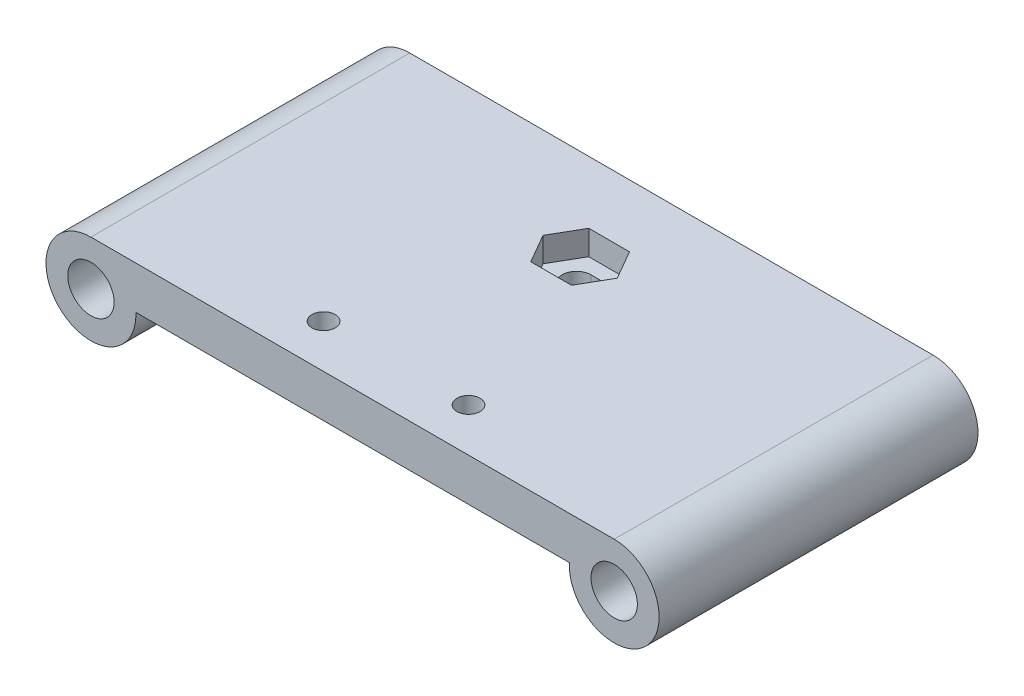
ISO-10303-21;
HEADER;
FILE_DESCRIPTION(('STEP AP214'),'2;1');
FILE_NAME('part.step','',(''),(''),'','','');
FILE_SCHEMA(('AUTOMOTIVE_DESIGN { 1 0 10303 214 1 1 1 1 }'));
ENDSEC;
DATA;
#1=APPLICATION_CONTEXT('core data for automotive mechanical design processes');
#2=APPLICATION_PROTOCOL_DEFINITION('international standard','automotive_design',2000,#1);
#3=PRODUCT_CONTEXT('',#1,'mechanical');
#4=PRODUCT('Part','Part','',(#3));
#5=PRODUCT_RELATED_PRODUCT_CATEGORY('part','',(#4));
#6=PRODUCT_DEFINITION_FORMATION('','',#4);
#7=PRODUCT_DEFINITION_CONTEXT('part definition',#1,'design');
#8=PRODUCT_DEFINITION('design','',#6,#7);
#9=PRODUCT_DEFINITION_SHAPE('','',#8);
#10=(LENGTH_UNIT() NAMED_UNIT(*) SI_UNIT(.MILLI.,.METRE.));
#11=(NAMED_UNIT(*) PLANE_ANGLE_UNIT() SI_UNIT($,.RADIAN.));
#12=(NAMED_UNIT(*) SI_UNIT($,.STERADIAN.) SOLID_ANGLE_UNIT());
#13=UNCERTAINTY_MEASURE_WITH_UNIT(LENGTH_MEASURE(1.E-05),#10,'distance_accuracy_value','');
#14=(GEOMETRIC_REPRESENTATION_CONTEXT(3) GLOBAL_UNCERTAINTY_ASSIGNED_CONTEXT((#13)) GLOBAL_UNIT_ASSIGNED_CONTEXT((#10,
#11,#12)) REPRESENTATION_CONTEXT('',''));
#15=CARTESIAN_POINT('',(0.,0.,0.));
#16=DIRECTION('',(0.,0.,1.));
#17=DIRECTION('',(1.,0.,0.));
#18=AXIS2_PLACEMENT_3D('',#15,#16,#17);
#19=CARTESIAN_POINT('',(4.99999999999993,-14.5560000000006,-3.));
#20=DIRECTION('',(0.,1.,0.));
#21=DIRECTION('',(-1.,0.,0.));
#22=AXIS2_PLACEMENT_3D('',#19,#20,#21);
#23=CYLINDRICAL_SURFACE('',#22,0.800000000000001);
#24=CARTESIAN_POINT('',(4.99999999999996,-8.35500000000047,-3.));
#25=DIRECTION('',(0.,1.,0.));
#26=DIRECTION('',(-1.,0.,0.));
#27=AXIS2_PLACEMENT_3D('',#24,#25,#26);
#28=CIRCLE('',#27,0.800000000000001);
#29=CARTESIAN_POINT('',(4.19999999999995,-8.35500000000047,-3.));
#30=VERTEX_POINT('',#29);
#31=EDGE_CURVE('E165',#30,#30,#28,.T.);
#32=ORIENTED_EDGE('',*,*,#31,.T.);
#33=EDGE_LOOP('',(#32));
#34=FACE_BOUND('',#33,.T.);
#35=CARTESIAN_POINT('',(4.99999999999995,-10.8000000000001,-3.));
#36=DIRECTION('',(0.,-1.,0.));
#37=DIRECTION('',(0.,0.,-1.));
#38=AXIS2_PLACEMENT_3D('',#35,#36,#37);
#39=CIRCLE('',#38,0.800000000000001);
#40=CARTESIAN_POINT('',(4.99999999999995,-10.8000000000001,-3.8));
#41=VERTEX_POINT('',#40);
#42=EDGE_CURVE('E40',#41,#41,#39,.F.);
#43=ORIENTED_EDGE('',*,*,#42,.F.);
#44=EDGE_LOOP('',(#43));
#45=FACE_BOUND('',#44,.T.);
#46=ADVANCED_FACE('F36',(#34,#45),#23,.F.);
#47=CARTESIAN_POINT('',(-5.00000000000007,-14.5560000000006,-3.));
#48=DIRECTION('',(0.,1.,0.));
#49=DIRECTION('',(-1.,0.,0.));
#50=AXIS2_PLACEMENT_3D('',#47,#48,#49);
#51=CYLINDRICAL_SURFACE('',#50,0.800000000000001);
#52=CARTESIAN_POINT('',(-5.00000000000004,-8.35500000000043,-3.));
#53=DIRECTION('',(0.,1.,0.));
#54=DIRECTION('',(-1.,0.,0.));
#55=AXIS2_PLACEMENT_3D('',#52,#53,#54);
#56=CIRCLE('',#55,0.800000000000001);
#57=CARTESIAN_POINT('',(-5.80000000000005,-8.35500000000043,-3.));
#58=VERTEX_POINT('',#57);
#59=EDGE_CURVE('E177',#58,#58,#56,.T.);
#60=ORIENTED_EDGE('',*,*,#59,.T.);
#61=EDGE_LOOP('',(#60));
#62=FACE_BOUND('',#61,.T.);
#63=CARTESIAN_POINT('',(-5.00000000000005,-10.8000000000001,-3.));
#64=DIRECTION('',(0.,-1.,0.));
#65=DIRECTION('',(0.,0.,-1.));
#66=AXIS2_PLACEMENT_3D('',#63,#64,#65);
#67=CIRCLE('',#66,0.800000000000001);
#68=CARTESIAN_POINT('',(-5.00000000000005,-10.8000000000001,-3.8));
#69=VERTEX_POINT('',#68);
#70=EDGE_CURVE('E262',#69,#69,#67,.F.);
#71=ORIENTED_EDGE('',*,*,#70,.F.);
#72=EDGE_LOOP('',(#71));
#73=FACE_BOUND('',#72,.T.);
#74=ADVANCED_FACE('F327',(#62,#73),#51,.F.);
#75=CARTESIAN_POINT('',(-0.25,-8.35400000000038,-15.7));
#76=DIRECTION('',(0.,-1.,0.));
#77=DIRECTION('',(0.,0.,-1.));
#78=AXIS2_PLACEMENT_3D('',#75,#76,#77);
#79=CYLINDRICAL_SURFACE('',#78,1.);
#80=CARTESIAN_POINT('',(-0.25,-10.0550000000004,-15.7));
#81=DIRECTION('',(0.,1.,0.));
#82=DIRECTION('',(-1.,0.,0.));
#83=AXIS2_PLACEMENT_3D('',#80,#81,#82);
#84=CIRCLE('',#83,1.);
#85=CARTESIAN_POINT('',(-0.25,-10.0550000000004,-14.7));
#86=VERTEX_POINT('',#85);
#87=CARTESIAN_POINT('',(-0.25,-10.0550000000004,-16.7));
#88=VERTEX_POINT('',#87);
#89=EDGE_CURVE('E60',#86,#88,#84,.F.);
#90=ORIENTED_EDGE('',*,*,#89,.F.);
#91=DIRECTION('',(0.,-1.,0.));
#92=VECTOR('',#91,1.);
#93=CARTESIAN_POINT('',(-0.25,-8.35400000000038,-14.7));
#94=LINE('',#93,#92);
#95=CARTESIAN_POINT('',(-0.25,-11.3000000000001,-14.7));
#96=VERTEX_POINT('',#95);
#97=EDGE_CURVE('E214',#86,#96,#94,.T.);
#98=ORIENTED_EDGE('',*,*,#97,.T.);
#99=CARTESIAN_POINT('',(-0.25,-11.3000000000001,-15.7));
#100=DIRECTION('',(0.,-1.,0.));
#101=DIRECTION('',(0.,0.,-1.));
#102=AXIS2_PLACEMENT_3D('',#99,#100,#101);
#103=CIRCLE('',#102,1.);
#104=CARTESIAN_POINT('',(-0.25,-11.3000000000001,-16.7));
#105=VERTEX_POINT('',#104);
#106=EDGE_CURVE('E201',#96,#105,#103,.T.);
#107=ORIENTED_EDGE('',*,*,#106,.T.);
#108=DIRECTION('',(0.,-1.,0.));
#109=VECTOR('',#108,1.);
#110=CARTESIAN_POINT('',(-0.25,-8.35400000000038,-16.7));
#111=LINE('',#110,#109);
#112=EDGE_CURVE('E213',#88,#105,#111,.T.);
#113=ORIENTED_EDGE('',*,*,#112,.F.);
#114=EDGE_LOOP('',(#90,#98,#107,#113));
#115=FACE_BOUND('',#114,.T.);
#116=ADVANCED_FACE('F333',(#115),#79,.F.);
#117=CARTESIAN_POINT('',(-0.25,-8.35400000000038,-14.7));
#118=DIRECTION('',(0.,0.,1.));
#119=DIRECTION('',(1.,0.,0.));
#120=AXIS2_PLACEMENT_3D('',#117,#118,#119);
#121=PLANE('',#120);
#122=DIRECTION('',(-1.,0.,0.));
#123=VECTOR('',#122,1.);
#124=CARTESIAN_POINT('',(-0.250000000000007,-10.0550000000004,-14.7));
#125=LINE('',#124,#123);
#126=CARTESIAN_POINT('',(0.25,-10.0550000000005,-14.7));
#127=VERTEX_POINT('',#126);
#128=EDGE_CURVE('E198',#127,#86,#125,.T.);
#129=ORIENTED_EDGE('',*,*,#128,.F.);
#130=DIRECTION('',(0.,-1.,0.));
#131=VECTOR('',#130,1.);
#132=CARTESIAN_POINT('',(0.25,-8.35400000000038,-14.7));
#133=LINE('',#132,#131);
#134=CARTESIAN_POINT('',(0.25,-11.3000000000001,-14.7));
#135=VERTEX_POINT('',#134);
#136=EDGE_CURVE('E217',#127,#135,#133,.T.);
#137=ORIENTED_EDGE('',*,*,#136,.T.);
#138=DIRECTION('',(-1.,0.,0.));
#139=VECTOR('',#138,1.);
#140=CARTESIAN_POINT('',(-0.25,-11.3000000000001,-14.7));
#141=LINE('',#140,#139);
#142=EDGE_CURVE('E210',#135,#96,#141,.T.);
#143=ORIENTED_EDGE('',*,*,#142,.T.);
#144=ORIENTED_EDGE('',*,*,#97,.F.);
#145=EDGE_LOOP('',(#129,#137,#143,#144));
#146=FACE_BOUND('',#145,.T.);
#147=ADVANCED_FACE('F359',(#146),#121,.F.);
#148=CARTESIAN_POINT('',(0.25,-8.35400000000038,-15.7));
#149=DIRECTION('',(0.,-1.,0.));
#150=DIRECTION('',(0.,0.,-1.));
#151=AXIS2_PLACEMENT_3D('',#148,#149,#150);
#152=CYLINDRICAL_SURFACE('',#151,1.);
#153=CARTESIAN_POINT('',(0.25,-10.0550000000005,-15.7));
#154=DIRECTION('',(0.,1.,0.));
#155=DIRECTION('',(-1.,0.,0.));
#156=AXIS2_PLACEMENT_3D('',#153,#154,#155);
#157=CIRCLE('',#156,1.);
#158=CARTESIAN_POINT('',(0.25,-10.0550000000005,-16.7));
#159=VERTEX_POINT('',#158);
#160=EDGE_CURVE('E189',#159,#127,#157,.F.);
#161=ORIENTED_EDGE('',*,*,#160,.F.);
#162=DIRECTION('',(0.,-1.,0.));
#163=VECTOR('',#162,1.);
#164=CARTESIAN_POINT('',(0.25,-8.35400000000038,-16.7));
#165=LINE('',#164,#163);
#166=CARTESIAN_POINT('',(0.25,-11.3000000000001,-16.7));
#167=VERTEX_POINT('',#166);
#168=EDGE_CURVE('E219',#159,#167,#165,.T.);
#169=ORIENTED_EDGE('',*,*,#168,.T.);
#170=CARTESIAN_POINT('',(0.25,-11.3000000000001,-15.7));
#171=DIRECTION('',(0.,-1.,0.));
#172=DIRECTION('',(0.,0.,-1.));
#173=AXIS2_PLACEMENT_3D('',#170,#171,#172);
#174=CIRCLE('',#173,1.);
#175=EDGE_CURVE('E207',#167,#135,#174,.T.);
#176=ORIENTED_EDGE('',*,*,#175,.T.);
#177=ORIENTED_EDGE('',*,*,#136,.F.);
#178=EDGE_LOOP('',(#161,#169,#176,#177));
#179=FACE_BOUND('',#178,.T.);
#180=ADVANCED_FACE('F362',(#179),#152,.F.);
#181=CARTESIAN_POINT('',(-0.25,-8.35400000000038,-16.7));
#182=DIRECTION('',(0.,0.,-1.));
#183=DIRECTION('',(-1.,0.,0.));
#184=AXIS2_PLACEMENT_3D('',#181,#182,#183);
#185=PLANE('',#184);
#186=DIRECTION('',(1.,0.,0.));
#187=VECTOR('',#186,1.);
#188=CARTESIAN_POINT('',(-0.250000000000007,-10.0550000000004,-16.7));
#189=LINE('',#188,#187);
#190=EDGE_CURVE('E11',#88,#159,#189,.T.);
#191=ORIENTED_EDGE('',*,*,#190,.F.);
#192=ORIENTED_EDGE('',*,*,#112,.T.);
#193=DIRECTION('',(1.,0.,0.));
#194=VECTOR('',#193,1.);
#195=CARTESIAN_POINT('',(-0.25,-11.3000000000001,-16.7));
#196=LINE('',#195,#194);
#197=EDGE_CURVE('E204',#105,#167,#196,.T.);
#198=ORIENTED_EDGE('',*,*,#197,.T.);
#199=ORIENTED_EDGE('',*,*,#168,.F.);
#200=EDGE_LOOP('',(#191,#192,#198,#199));
#201=FACE_BOUND('',#200,.T.);
#202=ADVANCED_FACE('F366',(#201),#185,.F.);
#203=CARTESIAN_POINT('',(18.0499999999999,-11.4550000000005,-22.));
#204=DIRECTION('',(0.,0.,1.));
#205=DIRECTION('',(1.,0.,0.));
#206=AXIS2_PLACEMENT_3D('',#203,#204,#205);
#207=CYLINDRICAL_SURFACE('',#206,3.1);
#208=CARTESIAN_POINT('',(18.0499999999999,-11.4550000000005,0.));
#209=DIRECTION('',(0.,0.,1.));
#210=DIRECTION('',(1.,0.,0.));
#211=AXIS2_PLACEMENT_3D('',#208,#209,#210);
#212=CIRCLE('',#211,3.1);
#213=CARTESIAN_POINT('',(14.953877424907,-11.3000000000001,0.));
#214=VERTEX_POINT('',#213);
#215=CARTESIAN_POINT('',(18.0499999999999,-8.35500000000052,0.));
#216=VERTEX_POINT('',#215);
#217=EDGE_CURVE('E243',#214,#216,#212,.T.);
#218=ORIENTED_EDGE('',*,*,#217,.F.);
#219=DIRECTION('',(0.,0.,1.));
#220=VECTOR('',#219,1.);
#221=CARTESIAN_POINT('',(14.953877424907,-11.3000000000001,-22.));
#222=LINE('',#221,#220);
#223=CARTESIAN_POINT('',(14.953877424907,-11.3000000000001,-22.));
#224=VERTEX_POINT('',#223);
#225=EDGE_CURVE('E45',#224,#214,#222,.T.);
#226=ORIENTED_EDGE('',*,*,#225,.F.);
#227=CARTESIAN_POINT('',(18.0499999999999,-11.4550000000005,-22.));
#228=DIRECTION('',(0.,0.,1.));
#229=DIRECTION('',(1.,0.,0.));
#230=AXIS2_PLACEMENT_3D('',#227,#228,#229);
#231=CIRCLE('',#230,3.1);
#232=CARTESIAN_POINT('',(18.0499999999999,-8.35500000000052,-22.));
#233=VERTEX_POINT('',#232);
#234=EDGE_CURVE('E225',#224,#233,#231,.T.);
#235=ORIENTED_EDGE('',*,*,#234,.T.);
#236=DIRECTION('',(0.,0.,1.));
#237=VECTOR('',#236,1.);
#238=CARTESIAN_POINT('',(18.0499999999999,-8.35500000000052,-22.));
#239=LINE('',#238,#237);
#240=EDGE_CURVE('E240',#233,#216,#239,.T.);
#241=ORIENTED_EDGE('',*,*,#240,.T.);
#242=EDGE_LOOP('',(#218,#226,#235,#241));
#243=FACE_BOUND('',#242,.T.);
#244=ADVANCED_FACE('F307',(#243),#207,.T.);
#245=CARTESIAN_POINT('',(0.,-11.3000000000001,-22.));
#246=DIRECTION('',(0.,-1.,0.));
#247=DIRECTION('',(0.,0.,-1.));
#248=AXIS2_PLACEMENT_3D('',#245,#246,#247);
#249=PLANE('',#248);
#250=CARTESIAN_POINT('',(4.99999999999999,-11.3000000000001,-3.));
#251=DIRECTION('',(0.,-1.,0.));
#252=DIRECTION('',(0.,0.,-1.));
#253=AXIS2_PLACEMENT_3D('',#250,#251,#252);
#254=CIRCLE('',#253,1.4);
#255=CARTESIAN_POINT('',(4.99999999999999,-11.3000000000001,-4.4));
#256=VERTEX_POINT('',#255);
#257=EDGE_CURVE('E269',#256,#256,#254,.T.);
#258=ORIENTED_EDGE('',*,*,#257,.F.);
#259=EDGE_LOOP('',(#258));
#260=FACE_BOUND('',#259,.T.);
#261=CARTESIAN_POINT('',(-5.00000000000001,-11.3000000000001,-3.));
#262=DIRECTION('',(0.,-1.,0.));
#263=DIRECTION('',(0.,0.,-1.));
#264=AXIS2_PLACEMENT_3D('',#261,#262,#263);
#265=CIRCLE('',#264,1.4);
#266=CARTESIAN_POINT('',(-5.00000000000001,-11.3000000000001,-4.4));
#267=VERTEX_POINT('',#266);
#268=EDGE_CURVE('E279',#267,#267,#265,.T.);
#269=ORIENTED_EDGE('',*,*,#268,.F.);
#270=EDGE_LOOP('',(#269));
#271=FACE_BOUND('',#270,.T.);
#272=ORIENTED_EDGE('',*,*,#106,.F.);
#273=ORIENTED_EDGE('',*,*,#142,.F.);
#274=ORIENTED_EDGE('',*,*,#175,.F.);
#275=ORIENTED_EDGE('',*,*,#197,.F.);
#276=EDGE_LOOP('',(#272,#273,#274,#275));
#277=FACE_BOUND('',#276,.T.);
#278=DIRECTION('',(1.,0.,0.));
#279=VECTOR('',#278,1.);
#280=CARTESIAN_POINT('',(0.,-11.3000000000001,0.));
#281=LINE('',#280,#279);
#282=CARTESIAN_POINT('',(-14.9538774249071,-11.3000000000001,0.));
#283=VERTEX_POINT('',#282);
#284=EDGE_CURVE('E252',#283,#214,#281,.T.);
#285=ORIENTED_EDGE('',*,*,#284,.F.);
#286=DIRECTION('',(0.,0.,1.));
#287=VECTOR('',#286,1.);
#288=CARTESIAN_POINT('',(-14.9538774249071,-11.3000000000001,-22.));
#289=LINE('',#288,#287);
#290=CARTESIAN_POINT('',(-14.9538774249071,-11.3000000000001,-22.));
#291=VERTEX_POINT('',#290);
#292=EDGE_CURVE('E258',#291,#283,#289,.T.);
#293=ORIENTED_EDGE('',*,*,#292,.F.);
#294=DIRECTION('',(1.,0.,0.));
#295=VECTOR('',#294,1.);
#296=CARTESIAN_POINT('',(0.,-11.3000000000001,-22.));
#297=LINE('',#296,#295);
#298=EDGE_CURVE('E234',#291,#224,#297,.T.);
#299=ORIENTED_EDGE('',*,*,#298,.T.);
#300=ORIENTED_EDGE('',*,*,#225,.T.);
#301=EDGE_LOOP('',(#285,#293,#299,#300));
#302=FACE_BOUND('',#301,.T.);
#303=ADVANCED_FACE('F315',(#260,#271,#277,#302),#249,.T.);
#304=CARTESIAN_POINT('',(-18.05,-11.4550000000004,-22.));
#305=DIRECTION('',(0.,0.,1.));
#306=DIRECTION('',(1.,0.,0.));
#307=AXIS2_PLACEMENT_3D('',#304,#305,#306);
#308=CYLINDRICAL_SURFACE('',#307,3.1);
#309=CARTESIAN_POINT('',(-18.05,-11.4550000000004,0.));
#310=DIRECTION('',(0.,0.,1.));
#311=DIRECTION('',(1.,0.,0.));
#312=AXIS2_PLACEMENT_3D('',#309,#310,#311);
#313=CIRCLE('',#312,3.1);
#314=CARTESIAN_POINT('',(-18.05,-8.35500000000038,0.));
#315=VERTEX_POINT('',#314);
#316=EDGE_CURVE('E249',#315,#283,#313,.T.);
#317=ORIENTED_EDGE('',*,*,#316,.F.);
#318=DIRECTION('',(0.,0.,1.));
#319=VECTOR('',#318,1.);
#320=CARTESIAN_POINT('',(-18.05,-8.35500000000038,-22.));
#321=LINE('',#320,#319);
#322=CARTESIAN_POINT('',(-18.05,-8.35500000000038,-22.));
#323=VERTEX_POINT('',#322);
#324=EDGE_CURVE('E260',#323,#315,#321,.T.);
#325=ORIENTED_EDGE('',*,*,#324,.F.);
#326=CARTESIAN_POINT('',(-18.05,-11.4550000000004,-22.));
#327=DIRECTION('',(0.,0.,1.));
#328=DIRECTION('',(1.,0.,0.));
#329=AXIS2_PLACEMENT_3D('',#326,#327,#328);
#330=CIRCLE('',#329,3.1);
#331=EDGE_CURVE('E231',#323,#291,#330,.T.);
#332=ORIENTED_EDGE('',*,*,#331,.T.);
#333=ORIENTED_EDGE('',*,*,#292,.T.);
#334=EDGE_LOOP('',(#317,#325,#332,#333));
#335=FACE_BOUND('',#334,.T.);
#336=ADVANCED_FACE('F292',(#335),#308,.T.);
#337=CARTESIAN_POINT('',(0.,-8.35500000000045,-22.));
#338=DIRECTION('',(0.,-1.,0.));
#339=DIRECTION('',(1.,0.,0.));
#340=AXIS2_PLACEMENT_3D('',#337,#338,#339);
#341=PLANE('',#340);
#342=ORIENTED_EDGE('',*,*,#59,.F.);
#343=EDGE_LOOP('',(#342));
#344=FACE_BOUND('',#343,.T.);
#345=ORIENTED_EDGE('',*,*,#31,.F.);
#346=EDGE_LOOP('',(#345));
#347=FACE_BOUND('',#346,.T.);
#348=DIRECTION('',(0.5,0.,-0.866025403784439));
#349=VECTOR('',#348,1.);
#350=CARTESIAN_POINT('',(-4.87874861213897,-8.35500000000043,-2.81674682452693));
#351=LINE('',#350,#349);
#352=CARTESIAN_POINT('',(1.40470053837925,-8.35500000000046,-13.7));
#353=VERTEX_POINT('',#352);
#354=CARTESIAN_POINT('',(2.55940107675851,-8.35500000000046,-15.7));
#355=VERTEX_POINT('',#354);
#356=EDGE_CURVE('E176',#353,#355,#351,.T.);
#357=ORIENTED_EDGE('',*,*,#356,.F.);
#358=DIRECTION('',(1.,0.,0.));
#359=VECTOR('',#358,1.);
#360=CARTESIAN_POINT('',(0.,-8.35500000000045,-13.7));
#361=LINE('',#360,#359);
#362=CARTESIAN_POINT('',(-1.40470053837925,-8.35500000000044,-13.7));
#363=VERTEX_POINT('',#362);
#364=EDGE_CURVE('E53',#363,#353,#361,.T.);
#365=ORIENTED_EDGE('',*,*,#364,.F.);
#366=DIRECTION('',(0.5,0.,0.866025403784439));
#367=VECTOR('',#366,1.);
#368=CARTESIAN_POINT('',(4.87874861213895,-8.35500000000047,-2.81674682452696));
#369=LINE('',#368,#367);
#370=CARTESIAN_POINT('',(-2.5594010767585,-8.35500000000044,-15.7));
#371=VERTEX_POINT('',#370);
#372=EDGE_CURVE('E159',#371,#363,#369,.T.);
#373=ORIENTED_EDGE('',*,*,#372,.F.);
#374=DIRECTION('',(-0.5,0.,0.866025403784439));
#375=VECTOR('',#374,1.);
#376=CARTESIAN_POINT('',(-8.71785022727672,-8.35500000000042,-5.03325317547303));
#377=LINE('',#376,#375);
#378=CARTESIAN_POINT('',(-1.40470053837925,-8.35500000000044,-17.7));
#379=VERTEX_POINT('',#378);
#380=EDGE_CURVE('E162',#379,#371,#377,.T.);
#381=ORIENTED_EDGE('',*,*,#380,.F.);
#382=DIRECTION('',(-1.,0.,0.));
#383=VECTOR('',#382,1.);
#384=CARTESIAN_POINT('',(0.,-8.35500000000045,-17.7));
#385=LINE('',#384,#383);
#386=CARTESIAN_POINT('',(1.40470053837925,-8.35500000000046,-17.7));
#387=VERTEX_POINT('',#386);
#388=EDGE_CURVE('E182',#387,#379,#385,.T.);
#389=ORIENTED_EDGE('',*,*,#388,.F.);
#390=DIRECTION('',(-0.5,0.,-0.866025403784439));
#391=VECTOR('',#390,1.);
#392=CARTESIAN_POINT('',(8.71785022727671,-8.35500000000048,-5.03325317547306));
#393=LINE('',#392,#391);
#394=EDGE_CURVE('E179',#355,#387,#393,.T.);
#395=ORIENTED_EDGE('',*,*,#394,.F.);
#396=EDGE_LOOP('',(#357,#365,#373,#381,#389,#395));
#397=FACE_BOUND('',#396,.T.);
#398=DIRECTION('',(1.,0.,0.));
#399=VECTOR('',#398,1.);
#400=CARTESIAN_POINT('',(0.,-8.35500000000045,0.));
#401=LINE('',#400,#399);
#402=EDGE_CURVE('E246',#315,#216,#401,.T.);
#403=ORIENTED_EDGE('',*,*,#402,.T.);
#404=ORIENTED_EDGE('',*,*,#240,.F.);
#405=DIRECTION('',(1.,0.,0.));
#406=VECTOR('',#405,1.);
#407=CARTESIAN_POINT('',(0.,-8.35500000000045,-22.));
#408=LINE('',#407,#406);
#409=EDGE_CURVE('E229',#323,#233,#408,.T.);
#410=ORIENTED_EDGE('',*,*,#409,.F.);
#411=ORIENTED_EDGE('',*,*,#324,.T.);
#412=EDGE_LOOP('',(#403,#404,#410,#411));
#413=FACE_BOUND('',#412,.T.);
#414=ADVANCED_FACE('F289',(#344,#347,#397,#413),#341,.F.);
#415=CARTESIAN_POINT('',(18.0499999999999,-11.4550000000005,-22.));
#416=DIRECTION('',(0.,0.,1.));
#417=DIRECTION('',(1.,0.,0.));
#418=AXIS2_PLACEMENT_3D('',#415,#416,#417);
#419=CYLINDRICAL_SURFACE('',#418,1.6);
#420=CARTESIAN_POINT('',(18.0499999999999,-11.4550000000005,-22.));
#421=DIRECTION('',(0.,0.,1.));
#422=DIRECTION('',(1.,0.,0.));
#423=AXIS2_PLACEMENT_3D('',#420,#421,#422);
#424=CIRCLE('',#423,1.6);
#425=CARTESIAN_POINT('',(19.6499999999999,-11.4550000000005,-22.));
#426=VERTEX_POINT('',#425);
#427=EDGE_CURVE('E222',#426,#426,#424,.T.);
#428=ORIENTED_EDGE('',*,*,#427,.F.);
#429=EDGE_LOOP('',(#428));
#430=FACE_BOUND('',#429,.T.);
#431=CARTESIAN_POINT('',(18.0499999999999,-11.4550000000005,0.));
#432=DIRECTION('',(0.,0.,1.));
#433=DIRECTION('',(1.,0.,0.));
#434=AXIS2_PLACEMENT_3D('',#431,#432,#433);
#435=CIRCLE('',#434,1.6);
#436=CARTESIAN_POINT('',(19.6499999999999,-11.4550000000005,0.));
#437=VERTEX_POINT('',#436);
#438=EDGE_CURVE('E216',#437,#437,#435,.T.);
#439=ORIENTED_EDGE('',*,*,#438,.T.);
#440=EDGE_LOOP('',(#439));
#441=FACE_BOUND('',#440,.T.);
#442=ADVANCED_FACE('F38',(#430,#441),#419,.F.);
#443=CARTESIAN_POINT('',(-18.05,-11.4550000000004,-22.));
#444=DIRECTION('',(0.,0.,1.));
#445=DIRECTION('',(1.,0.,0.));
#446=AXIS2_PLACEMENT_3D('',#443,#444,#445);
#447=CYLINDRICAL_SURFACE('',#446,1.6);
#448=CARTESIAN_POINT('',(-18.05,-11.4550000000004,-22.));
#449=DIRECTION('',(0.,0.,1.));
#450=DIRECTION('',(1.,0.,0.));
#451=AXIS2_PLACEMENT_3D('',#448,#449,#450);
#452=CIRCLE('',#451,1.6);
#453=CARTESIAN_POINT('',(-16.45,-11.4550000000004,-22.));
#454=VERTEX_POINT('',#453);
#455=EDGE_CURVE('E237',#454,#454,#452,.T.);
#456=ORIENTED_EDGE('',*,*,#455,.F.);
#457=EDGE_LOOP('',(#456));
#458=FACE_BOUND('',#457,.T.);
#459=CARTESIAN_POINT('',(-18.05,-11.4550000000004,0.));
#460=DIRECTION('',(0.,0.,1.));
#461=DIRECTION('',(1.,0.,0.));
#462=AXIS2_PLACEMENT_3D('',#459,#460,#461);
#463=CIRCLE('',#462,1.6);
#464=CARTESIAN_POINT('',(-16.45,-11.4550000000004,0.));
#465=VERTEX_POINT('',#464);
#466=EDGE_CURVE('E226',#465,#465,#463,.T.);
#467=ORIENTED_EDGE('',*,*,#466,.T.);
#468=EDGE_LOOP('',(#467));
#469=FACE_BOUND('',#468,.T.);
#470=ADVANCED_FACE('F376',(#458,#469),#447,.F.);
#471=CARTESIAN_POINT('',(0.,0.,-22.));
#472=DIRECTION('',(0.,0.,1.));
#473=DIRECTION('',(1.,0.,0.));
#474=AXIS2_PLACEMENT_3D('',#471,#472,#473);
#475=PLANE('',#474);
#476=ORIENTED_EDGE('',*,*,#427,.T.);
#477=EDGE_LOOP('',(#476));
#478=FACE_BOUND('',#477,.T.);
#479=ORIENTED_EDGE('',*,*,#234,.F.);
#480=ORIENTED_EDGE('',*,*,#298,.F.);
#481=ORIENTED_EDGE('',*,*,#331,.F.);
#482=ORIENTED_EDGE('',*,*,#409,.T.);
#483=EDGE_LOOP('',(#479,#480,#481,#482));
#484=FACE_BOUND('',#483,.T.);
#485=ORIENTED_EDGE('',*,*,#455,.T.);
#486=EDGE_LOOP('',(#485));
#487=FACE_BOUND('',#486,.T.);
#488=ADVANCED_FACE('F311',(#478,#484,#487),#475,.F.);
#489=CARTESIAN_POINT('',(0.,0.,0.));
#490=DIRECTION('',(0.,0.,1.));
#491=DIRECTION('',(1.,0.,0.));
#492=AXIS2_PLACEMENT_3D('',#489,#490,#491);
#493=PLANE('',#492);
#494=ORIENTED_EDGE('',*,*,#438,.F.);
#495=EDGE_LOOP('',(#494));
#496=FACE_BOUND('',#495,.T.);
#497=ORIENTED_EDGE('',*,*,#217,.T.);
#498=ORIENTED_EDGE('',*,*,#402,.F.);
#499=ORIENTED_EDGE('',*,*,#316,.T.);
#500=ORIENTED_EDGE('',*,*,#284,.T.);
#501=EDGE_LOOP('',(#497,#498,#499,#500));
#502=FACE_BOUND('',#501,.T.);
#503=ORIENTED_EDGE('',*,*,#466,.F.);
#504=EDGE_LOOP('',(#503));
#505=FACE_BOUND('',#504,.T.);
#506=ADVANCED_FACE('F303',(#496,#502,#505),#493,.T.);
#507=CARTESIAN_POINT('',(0.,-10.0550000000005,0.));
#508=DIRECTION('',(0.,1.,0.));
#509=DIRECTION('',(-1.,0.,0.));
#510=AXIS2_PLACEMENT_3D('',#507,#508,#509);
#511=PLANE('',#510);
#512=DIRECTION('',(1.,0.,0.));
#513=VECTOR('',#512,1.);
#514=CARTESIAN_POINT('',(0.,-10.0550000000005,-13.7));
#515=LINE('',#514,#513);
#516=CARTESIAN_POINT('',(-1.40470053837925,-10.0550000000004,-13.7));
#517=VERTEX_POINT('',#516);
#518=CARTESIAN_POINT('',(1.40470053837924,-10.0550000000005,-13.7));
#519=VERTEX_POINT('',#518);
#520=EDGE_CURVE('E140',#517,#519,#515,.T.);
#521=ORIENTED_EDGE('',*,*,#520,.T.);
#522=DIRECTION('',(0.5,0.,-0.866025403784439));
#523=VECTOR('',#522,1.);
#524=CARTESIAN_POINT('',(-4.87874861213897,-10.0550000000004,-2.81674682452693));
#525=LINE('',#524,#523);
#526=CARTESIAN_POINT('',(2.5594010767585,-10.0550000000005,-15.7));
#527=VERTEX_POINT('',#526);
#528=EDGE_CURVE('E149',#519,#527,#525,.T.);
#529=ORIENTED_EDGE('',*,*,#528,.T.);
#530=DIRECTION('',(-0.5,0.,-0.866025403784439));
#531=VECTOR('',#530,1.);
#532=CARTESIAN_POINT('',(8.7178502272767,-10.0550000000005,-5.03325317547306));
#533=LINE('',#532,#531);
#534=CARTESIAN_POINT('',(1.40470053837925,-10.0550000000005,-17.7));
#535=VERTEX_POINT('',#534);
#536=EDGE_CURVE('E154',#527,#535,#533,.T.);
#537=ORIENTED_EDGE('',*,*,#536,.T.);
#538=DIRECTION('',(-1.,0.,0.));
#539=VECTOR('',#538,1.);
#540=CARTESIAN_POINT('',(0.,-10.0550000000005,-17.7));
#541=LINE('',#540,#539);
#542=CARTESIAN_POINT('',(-1.40470053837926,-10.0550000000004,-17.7));
#543=VERTEX_POINT('',#542);
#544=EDGE_CURVE('E169',#535,#543,#541,.T.);
#545=ORIENTED_EDGE('',*,*,#544,.T.);
#546=DIRECTION('',(-0.5,0.,0.866025403784439));
#547=VECTOR('',#546,1.);
#548=CARTESIAN_POINT('',(-8.71785022727673,-10.0550000000004,-5.03325317547303));
#549=LINE('',#548,#547);
#550=CARTESIAN_POINT('',(-2.55940107675851,-10.0550000000004,-15.7));
#551=VERTEX_POINT('',#550);
#552=EDGE_CURVE('E172',#543,#551,#549,.T.);
#553=ORIENTED_EDGE('',*,*,#552,.T.);
#554=DIRECTION('',(0.5,0.,0.866025403784439));
#555=VECTOR('',#554,1.);
#556=CARTESIAN_POINT('',(4.87874861213895,-10.0550000000005,-2.81674682452696));
#557=LINE('',#556,#555);
#558=EDGE_CURVE('E146',#551,#517,#557,.T.);
#559=ORIENTED_EDGE('',*,*,#558,.T.);
#560=EDGE_LOOP('',(#521,#529,#537,#545,#553,#559));
#561=FACE_BOUND('',#560,.T.);
#562=ORIENTED_EDGE('',*,*,#89,.T.);
#563=ORIENTED_EDGE('',*,*,#190,.T.);
#564=ORIENTED_EDGE('',*,*,#160,.T.);
#565=ORIENTED_EDGE('',*,*,#128,.T.);
#566=EDGE_LOOP('',(#562,#563,#564,#565));
#567=FACE_BOUND('',#566,.T.);
#568=ADVANCED_FACE('F156',(#561,#567),#511,.T.);
#569=CARTESIAN_POINT('',(0.,-10.0550000000005,-13.7));
#570=DIRECTION('',(0.,0.,1.));
#571=DIRECTION('',(1.,0.,0.));
#572=AXIS2_PLACEMENT_3D('',#569,#570,#571);
#573=PLANE('',#572);
#574=ORIENTED_EDGE('',*,*,#364,.T.);
#575=DIRECTION('',(0.,1.,0.));
#576=VECTOR('',#575,1.);
#577=CARTESIAN_POINT('',(1.40470053837924,-10.0550000000005,-13.7));
#578=LINE('',#577,#576);
#579=EDGE_CURVE('E136',#519,#353,#578,.T.);
#580=ORIENTED_EDGE('',*,*,#579,.F.);
#581=ORIENTED_EDGE('',*,*,#520,.F.);
#582=DIRECTION('',(0.,1.,0.));
#583=VECTOR('',#582,1.);
#584=CARTESIAN_POINT('',(-1.40470053837925,-10.0550000000004,-13.7));
#585=LINE('',#584,#583);
#586=EDGE_CURVE('E187',#517,#363,#585,.T.);
#587=ORIENTED_EDGE('',*,*,#586,.T.);
#588=EDGE_LOOP('',(#574,#580,#581,#587));
#589=FACE_BOUND('',#588,.T.);
#590=ADVANCED_FACE('F138',(#589),#573,.F.);
#591=CARTESIAN_POINT('',(4.87874861213895,-10.0550000000005,-2.81674682452696));
#592=DIRECTION('',(-0.866025403784439,0.,0.5));
#593=DIRECTION('',(0.5,0.,0.866025403784439));
#594=AXIS2_PLACEMENT_3D('',#591,#592,#593);
#595=PLANE('',#594);
#596=ORIENTED_EDGE('',*,*,#372,.T.);
#597=ORIENTED_EDGE('',*,*,#586,.F.);
#598=ORIENTED_EDGE('',*,*,#558,.F.);
#599=DIRECTION('',(0.,1.,0.));
#600=VECTOR('',#599,1.);
#601=CARTESIAN_POINT('',(-2.55940107675851,-10.0550000000004,-15.7));
#602=LINE('',#601,#600);
#603=EDGE_CURVE('E190',#551,#371,#602,.T.);
#604=ORIENTED_EDGE('',*,*,#603,.T.);
#605=EDGE_LOOP('',(#596,#597,#598,#604));
#606=FACE_BOUND('',#605,.T.);
#607=ADVANCED_FACE('F339',(#606),#595,.F.);
#608=CARTESIAN_POINT('',(-8.71785022727673,-10.0550000000004,-5.03325317547303));
#609=DIRECTION('',(-0.866025403784439,0.,-0.5));
#610=DIRECTION('',(-0.5,0.,0.866025403784439));
#611=AXIS2_PLACEMENT_3D('',#608,#609,#610);
#612=PLANE('',#611);
#613=ORIENTED_EDGE('',*,*,#380,.T.);
#614=ORIENTED_EDGE('',*,*,#603,.F.);
#615=ORIENTED_EDGE('',*,*,#552,.F.);
#616=DIRECTION('',(0.,1.,0.));
#617=VECTOR('',#616,1.);
#618=CARTESIAN_POINT('',(-1.40470053837926,-10.0550000000004,-17.7));
#619=LINE('',#618,#617);
#620=EDGE_CURVE('E192',#543,#379,#619,.T.);
#621=ORIENTED_EDGE('',*,*,#620,.T.);
#622=EDGE_LOOP('',(#613,#614,#615,#621));
#623=FACE_BOUND('',#622,.T.);
#624=ADVANCED_FACE('F342',(#623),#612,.F.);
#625=CARTESIAN_POINT('',(0.,-10.0550000000005,-17.7));
#626=DIRECTION('',(0.,0.,-1.));
#627=DIRECTION('',(-1.,0.,0.));
#628=AXIS2_PLACEMENT_3D('',#625,#626,#627);
#629=PLANE('',#628);
#630=ORIENTED_EDGE('',*,*,#388,.T.);
#631=ORIENTED_EDGE('',*,*,#620,.F.);
#632=ORIENTED_EDGE('',*,*,#544,.F.);
#633=DIRECTION('',(0.,1.,0.));
#634=VECTOR('',#633,1.);
#635=CARTESIAN_POINT('',(1.40470053837925,-10.0550000000005,-17.7));
#636=LINE('',#635,#634);
#637=EDGE_CURVE('E194',#535,#387,#636,.T.);
#638=ORIENTED_EDGE('',*,*,#637,.T.);
#639=EDGE_LOOP('',(#630,#631,#632,#638));
#640=FACE_BOUND('',#639,.T.);
#641=ADVANCED_FACE('F346',(#640),#629,.F.);
#642=CARTESIAN_POINT('',(8.7178502272767,-10.0550000000005,-5.03325317547306));
#643=DIRECTION('',(0.866025403784439,0.,-0.5));
#644=DIRECTION('',(-0.5,0.,-0.866025403784439));
#645=AXIS2_PLACEMENT_3D('',#642,#643,#644);
#646=PLANE('',#645);
#647=ORIENTED_EDGE('',*,*,#394,.T.);
#648=ORIENTED_EDGE('',*,*,#637,.F.);
#649=ORIENTED_EDGE('',*,*,#536,.F.);
#650=DIRECTION('',(0.,1.,0.));
#651=VECTOR('',#650,1.);
#652=CARTESIAN_POINT('',(2.5594010767585,-10.0550000000005,-15.7));
#653=LINE('',#652,#651);
#654=EDGE_CURVE('E145',#527,#355,#653,.T.);
#655=ORIENTED_EDGE('',*,*,#654,.T.);
#656=EDGE_LOOP('',(#647,#648,#649,#655));
#657=FACE_BOUND('',#656,.T.);
#658=ADVANCED_FACE('F350',(#657),#646,.F.);
#659=CARTESIAN_POINT('',(-4.87874861213897,-10.0550000000004,-2.81674682452693));
#660=DIRECTION('',(0.866025403784439,0.,0.5));
#661=DIRECTION('',(0.5,0.,-0.866025403784439));
#662=AXIS2_PLACEMENT_3D('',#659,#660,#661);
#663=PLANE('',#662);
#664=ORIENTED_EDGE('',*,*,#356,.T.);
#665=ORIENTED_EDGE('',*,*,#654,.F.);
#666=ORIENTED_EDGE('',*,*,#528,.F.);
#667=ORIENTED_EDGE('',*,*,#579,.T.);
#668=EDGE_LOOP('',(#664,#665,#666,#667));
#669=FACE_BOUND('',#668,.T.);
#670=ADVANCED_FACE('F150',(#669),#663,.F.);
#671=CARTESIAN_POINT('',(-5.00000000000001,-10.8000000000001,-3.));
#672=DIRECTION('',(0.,-1.,0.));
#673=DIRECTION('',(0.,0.,-1.));
#674=AXIS2_PLACEMENT_3D('',#671,#672,#673);
#675=PLANE('',#674);
#676=CARTESIAN_POINT('',(-5.00000000000001,-10.8000000000001,-3.));
#677=DIRECTION('',(0.,-1.,0.));
#678=DIRECTION('',(0.,0.,-1.));
#679=AXIS2_PLACEMENT_3D('',#676,#677,#678);
#680=CIRCLE('',#679,1.4);
#681=CARTESIAN_POINT('',(-5.00000000000001,-10.8000000000001,-4.4));
#682=VERTEX_POINT('',#681);
#683=EDGE_CURVE('E274',#682,#682,#680,.T.);
#684=ORIENTED_EDGE('',*,*,#683,.T.);
#685=EDGE_LOOP('',(#684));
#686=FACE_BOUND('',#685,.T.);
#687=ORIENTED_EDGE('',*,*,#70,.T.);
#688=EDGE_LOOP('',(#687));
#689=FACE_BOUND('',#688,.T.);
#690=ADVANCED_FACE('F356',(#686,#689),#675,.T.);
#691=CARTESIAN_POINT('',(-5.00000000000001,-10.8000000000001,-3.));
#692=DIRECTION('',(0.,-1.,0.));
#693=DIRECTION('',(0.,0.,-1.));
#694=AXIS2_PLACEMENT_3D('',#691,#692,#693);
#695=CYLINDRICAL_SURFACE('',#694,1.4);
#696=ORIENTED_EDGE('',*,*,#683,.F.);
#697=EDGE_LOOP('',(#696));
#698=FACE_BOUND('',#697,.T.);
#699=ORIENTED_EDGE('',*,*,#268,.T.);
#700=EDGE_LOOP('',(#699));
#701=FACE_BOUND('',#700,.T.);
#702=ADVANCED_FACE('F426',(#698,#701),#695,.F.);
#703=CARTESIAN_POINT('',(4.99999999999999,-10.8000000000001,-3.));
#704=DIRECTION('',(0.,-1.,0.));
#705=DIRECTION('',(0.,0.,-1.));
#706=AXIS2_PLACEMENT_3D('',#703,#704,#705);
#707=PLANE('',#706);
#708=CARTESIAN_POINT('',(4.99999999999999,-10.8000000000001,-3.));
#709=DIRECTION('',(0.,-1.,0.));
#710=DIRECTION('',(0.,0.,-1.));
#711=AXIS2_PLACEMENT_3D('',#708,#709,#710);
#712=CIRCLE('',#711,1.4);
#713=CARTESIAN_POINT('',(4.99999999999999,-10.8000000000001,-4.4));
#714=VERTEX_POINT('',#713);
#715=EDGE_CURVE('E264',#714,#714,#712,.T.);
#716=ORIENTED_EDGE('',*,*,#715,.T.);
#717=EDGE_LOOP('',(#716));
#718=FACE_BOUND('',#717,.T.);
#719=ORIENTED_EDGE('',*,*,#42,.T.);
#720=EDGE_LOOP('',(#719));
#721=FACE_BOUND('',#720,.T.);
#722=ADVANCED_FACE('F436',(#718,#721),#707,.T.);
#723=CARTESIAN_POINT('',(4.99999999999999,-10.8000000000001,-3.));
#724=DIRECTION('',(0.,-1.,0.));
#725=DIRECTION('',(0.,0.,-1.));
#726=AXIS2_PLACEMENT_3D('',#723,#724,#725);
#727=CYLINDRICAL_SURFACE('',#726,1.4);
#728=ORIENTED_EDGE('',*,*,#715,.F.);
#729=EDGE_LOOP('',(#728));
#730=FACE_BOUND('',#729,.T.);
#731=ORIENTED_EDGE('',*,*,#257,.T.);
#732=EDGE_LOOP('',(#731));
#733=FACE_BOUND('',#732,.T.);
#734=ADVANCED_FACE('F445',(#730,#733),#727,.F.);
#735=CLOSED_SHELL('',(#46,#74,#116,#147,#180,#202,#244,#303,#336,#414,#442,#470,#488,#506,#568,
#590,#607,#624,#641,#658,#670,#690,#702,#722,#734));
#736=MANIFOLD_SOLID_BREP('B2',#735);
#737=ADVANCED_BREP_SHAPE_REPRESENTATION('',(#18,#736),#14);
#738=SHAPE_DEFINITION_REPRESENTATION(#9,#737);
ENDSEC;
END-ISO-10303-21;
